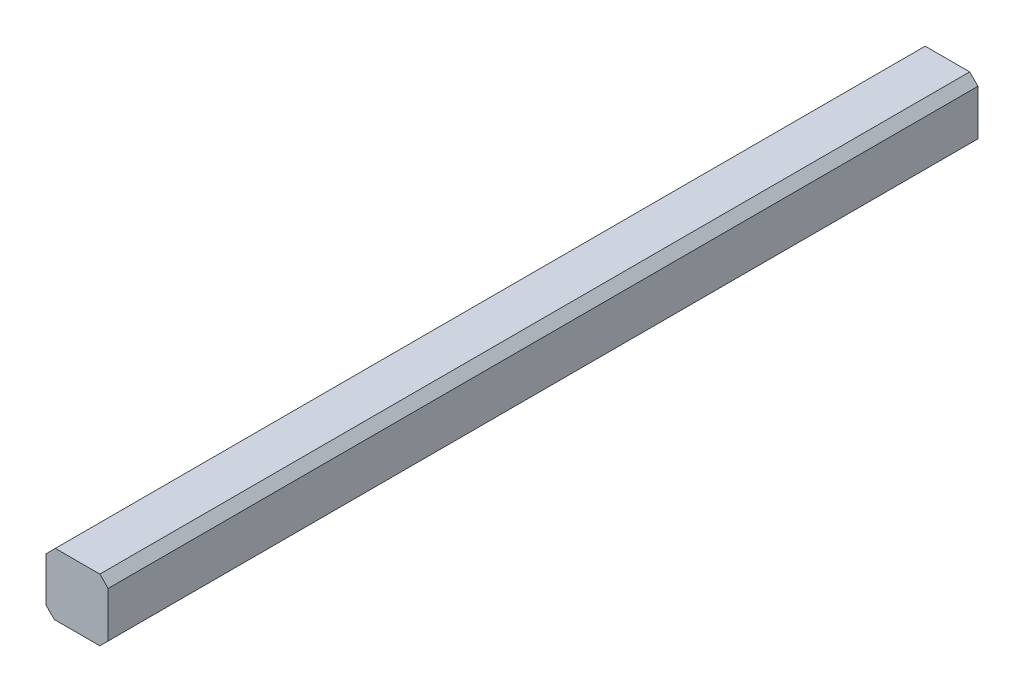
ISO-10303-21;
HEADER;
FILE_DESCRIPTION(('STEP AP214'),'2;1');
FILE_NAME('part.step','',(''),(''),'','','');
FILE_SCHEMA(('AUTOMOTIVE_DESIGN { 1 0 10303 214 1 1 1 1 }'));
ENDSEC;
DATA;
#1=APPLICATION_CONTEXT('core data for automotive mechanical design processes');
#2=APPLICATION_PROTOCOL_DEFINITION('international standard','automotive_design',2000,#1);
#3=PRODUCT_CONTEXT('',#1,'mechanical');
#4=PRODUCT('Part','Part','',(#3));
#5=PRODUCT_RELATED_PRODUCT_CATEGORY('part','',(#4));
#6=PRODUCT_DEFINITION_FORMATION('','',#4);
#7=PRODUCT_DEFINITION_CONTEXT('part definition',#1,'design');
#8=PRODUCT_DEFINITION('design','',#6,#7);
#9=PRODUCT_DEFINITION_SHAPE('','',#8);
#10=(LENGTH_UNIT() NAMED_UNIT(*) SI_UNIT(.MILLI.,.METRE.));
#11=(NAMED_UNIT(*) PLANE_ANGLE_UNIT() SI_UNIT($,.RADIAN.));
#12=(NAMED_UNIT(*) SI_UNIT($,.STERADIAN.) SOLID_ANGLE_UNIT());
#13=UNCERTAINTY_MEASURE_WITH_UNIT(LENGTH_MEASURE(1.E-05),#10,'distance_accuracy_value','');
#14=(GEOMETRIC_REPRESENTATION_CONTEXT(3) GLOBAL_UNCERTAINTY_ASSIGNED_CONTEXT((#13)) GLOBAL_UNIT_ASSIGNED_CONTEXT((#10,
#11,#12)) REPRESENTATION_CONTEXT('',''));
#15=CARTESIAN_POINT('',(0.,0.,0.));
#16=DIRECTION('',(0.,0.,1.));
#17=DIRECTION('',(1.,0.,0.));
#18=AXIS2_PLACEMENT_3D('',#15,#16,#17);
#19=CARTESIAN_POINT('',(-0.381,-0.2794,0.));
#20=DIRECTION('',(-1.,0.,0.));
#21=DIRECTION('',(0.,0.,1.));
#22=AXIS2_PLACEMENT_3D('',#19,#20,#21);
#23=PLANE('',#22);
#24=DIRECTION('',(0.,0.,1.));
#25=VECTOR('',#24,1.);
#26=CARTESIAN_POINT('',(-0.381,0.2667,0.));
#27=LINE('',#26,#25);
#28=CARTESIAN_POINT('',(-0.381,0.2667,0.));
#29=VERTEX_POINT('',#28);
#30=CARTESIAN_POINT('',(-0.381,0.2667,10.668));
#31=VERTEX_POINT('',#30);
#32=EDGE_CURVE('E86',#29,#31,#27,.T.);
#33=ORIENTED_EDGE('',*,*,#32,.F.);
#34=DIRECTION('',(0.,1.,0.));
#35=VECTOR('',#34,1.);
#36=CARTESIAN_POINT('',(-0.381,-0.2794,0.));
#37=LINE('',#36,#35);
#38=CARTESIAN_POINT('',(-0.381,-0.2794,0.));
#39=VERTEX_POINT('',#38);
#40=EDGE_CURVE('E79',#29,#39,#37,.F.);
#41=ORIENTED_EDGE('',*,*,#40,.T.);
#42=DIRECTION('',(0.,0.,1.));
#43=VECTOR('',#42,1.);
#44=CARTESIAN_POINT('',(-0.381,-0.2794,0.));
#45=LINE('',#44,#43);
#46=CARTESIAN_POINT('',(-0.381,-0.2794,10.668));
#47=VERTEX_POINT('',#46);
#48=EDGE_CURVE('E89',#47,#39,#45,.F.);
#49=ORIENTED_EDGE('',*,*,#48,.F.);
#50=DIRECTION('',(0.,1.,0.));
#51=VECTOR('',#50,1.);
#52=CARTESIAN_POINT('',(-0.381,-0.2794,10.668));
#53=LINE('',#52,#51);
#54=EDGE_CURVE('E20',#47,#31,#53,.T.);
#55=ORIENTED_EDGE('',*,*,#54,.T.);
#56=EDGE_LOOP('',(#33,#41,#49,#55));
#57=FACE_BOUND('',#56,.T.);
#58=ADVANCED_FACE('F17',(#57),#23,.T.);
#59=CARTESIAN_POINT('',(-0.381,0.2667,0.));
#60=DIRECTION('',(-0.707106781186548,0.707106781186548,0.));
#61=DIRECTION('',(-0.707106781186548,-0.707106781186548,0.));
#62=AXIS2_PLACEMENT_3D('',#59,#60,#61);
#63=PLANE('',#62);
#64=DIRECTION('',(0.,0.,1.));
#65=VECTOR('',#64,1.);
#66=CARTESIAN_POINT('',(-0.2667,0.381,0.));
#67=LINE('',#66,#65);
#68=CARTESIAN_POINT('',(-0.2667,0.381,0.));
#69=VERTEX_POINT('',#68);
#70=CARTESIAN_POINT('',(-0.2667,0.381,10.668));
#71=VERTEX_POINT('',#70);
#72=EDGE_CURVE('E111',#69,#71,#67,.T.);
#73=ORIENTED_EDGE('',*,*,#72,.F.);
#74=DIRECTION('',(-0.707106781186548,-0.707106781186548,0.));
#75=VECTOR('',#74,1.);
#76=CARTESIAN_POINT('',(-0.381,0.2667,0.));
#77=LINE('',#76,#75);
#78=EDGE_CURVE('E100',#69,#29,#77,.T.);
#79=ORIENTED_EDGE('',*,*,#78,.T.);
#80=ORIENTED_EDGE('',*,*,#32,.T.);
#81=DIRECTION('',(-0.707106781186548,-0.707106781186548,0.));
#82=VECTOR('',#81,1.);
#83=CARTESIAN_POINT('',(-0.381,0.2667,10.668));
#84=LINE('',#83,#82);
#85=EDGE_CURVE('E93',#31,#71,#84,.F.);
#86=ORIENTED_EDGE('',*,*,#85,.T.);
#87=EDGE_LOOP('',(#73,#79,#80,#86));
#88=FACE_BOUND('',#87,.T.);
#89=ADVANCED_FACE('F102',(#88),#63,.T.);
#90=CARTESIAN_POINT('',(-0.2794,-0.381,0.));
#91=DIRECTION('',(-0.707106781186548,-0.707106781186548,0.));
#92=DIRECTION('',(0.707106781186548,-0.707106781186548,0.));
#93=AXIS2_PLACEMENT_3D('',#90,#91,#92);
#94=PLANE('',#93);
#95=ORIENTED_EDGE('',*,*,#48,.T.);
#96=DIRECTION('',(0.707106781186548,-0.707106781186548,0.));
#97=VECTOR('',#96,1.);
#98=CARTESIAN_POINT('',(-0.2794,-0.381,0.));
#99=LINE('',#98,#97);
#100=CARTESIAN_POINT('',(-0.2794,-0.381,0.));
#101=VERTEX_POINT('',#100);
#102=EDGE_CURVE('E109',#39,#101,#99,.T.);
#103=ORIENTED_EDGE('',*,*,#102,.T.);
#104=DIRECTION('',(0.,0.,-1.));
#105=VECTOR('',#104,1.);
#106=CARTESIAN_POINT('',(-0.2794,-0.381,0.));
#107=LINE('',#106,#105);
#108=CARTESIAN_POINT('',(-0.2794,-0.381,10.668));
#109=VERTEX_POINT('',#108);
#110=EDGE_CURVE('E117',#109,#101,#107,.T.);
#111=ORIENTED_EDGE('',*,*,#110,.F.);
#112=DIRECTION('',(0.707106781186548,-0.707106781186548,0.));
#113=VECTOR('',#112,1.);
#114=CARTESIAN_POINT('',(-0.2794,-0.381,10.668));
#115=LINE('',#114,#113);
#116=EDGE_CURVE('E106',#109,#47,#115,.F.);
#117=ORIENTED_EDGE('',*,*,#116,.T.);
#118=EDGE_LOOP('',(#95,#103,#111,#117));
#119=FACE_BOUND('',#118,.T.);
#120=ADVANCED_FACE('F163',(#119),#94,.T.);
#121=CARTESIAN_POINT('',(-0.2667,0.381,0.));
#122=DIRECTION('',(0.,1.,0.));
#123=DIRECTION('',(0.,0.,1.));
#124=AXIS2_PLACEMENT_3D('',#121,#122,#123);
#125=PLANE('',#124);
#126=DIRECTION('',(0.,0.,1.));
#127=VECTOR('',#126,1.);
#128=CARTESIAN_POINT('',(0.2794,0.381,0.));
#129=LINE('',#128,#127);
#130=CARTESIAN_POINT('',(0.2794,0.381,0.));
#131=VERTEX_POINT('',#130);
#132=CARTESIAN_POINT('',(0.2794,0.381,10.668));
#133=VERTEX_POINT('',#132);
#134=EDGE_CURVE('E122',#131,#133,#129,.T.);
#135=ORIENTED_EDGE('',*,*,#134,.F.);
#136=DIRECTION('',(1.,0.,0.));
#137=VECTOR('',#136,1.);
#138=CARTESIAN_POINT('',(-0.2667,0.381,0.));
#139=LINE('',#138,#137);
#140=EDGE_CURVE('E114',#131,#69,#139,.F.);
#141=ORIENTED_EDGE('',*,*,#140,.T.);
#142=ORIENTED_EDGE('',*,*,#72,.T.);
#143=DIRECTION('',(1.,0.,0.));
#144=VECTOR('',#143,1.);
#145=CARTESIAN_POINT('',(-0.2667,0.381,10.668));
#146=LINE('',#145,#144);
#147=EDGE_CURVE('E96',#71,#133,#146,.T.);
#148=ORIENTED_EDGE('',*,*,#147,.T.);
#149=EDGE_LOOP('',(#135,#141,#142,#148));
#150=FACE_BOUND('',#149,.T.);
#151=ADVANCED_FACE('F161',(#150),#125,.T.);
#152=CARTESIAN_POINT('',(0.2794,-0.381,0.));
#153=DIRECTION('',(0.,-1.,0.));
#154=DIRECTION('',(0.,0.,-1.));
#155=AXIS2_PLACEMENT_3D('',#152,#153,#154);
#156=PLANE('',#155);
#157=ORIENTED_EDGE('',*,*,#110,.T.);
#158=DIRECTION('',(1.,0.,0.));
#159=VECTOR('',#158,1.);
#160=CARTESIAN_POINT('',(0.2794,-0.381,0.));
#161=LINE('',#160,#159);
#162=CARTESIAN_POINT('',(0.279400000000018,-0.381000000000018,0.));
#163=VERTEX_POINT('',#162);
#164=EDGE_CURVE('E120',#101,#163,#161,.T.);
#165=ORIENTED_EDGE('',*,*,#164,.T.);
#166=DIRECTION('',(0.,0.,1.));
#167=VECTOR('',#166,1.);
#168=CARTESIAN_POINT('',(0.279400000000072,-0.381000000000072,0.));
#169=LINE('',#168,#167);
#170=CARTESIAN_POINT('',(0.279400000000018,-0.381000000000018,10.668));
#171=VERTEX_POINT('',#170);
#172=EDGE_CURVE('E132',#171,#163,#169,.F.);
#173=ORIENTED_EDGE('',*,*,#172,.F.);
#174=DIRECTION('',(1.,0.,0.));
#175=VECTOR('',#174,1.);
#176=CARTESIAN_POINT('',(-0.381,-0.381,10.668));
#177=LINE('',#176,#175);
#178=EDGE_CURVE('E125',#109,#171,#177,.T.);
#179=ORIENTED_EDGE('',*,*,#178,.F.);
#180=EDGE_LOOP('',(#157,#165,#173,#179));
#181=FACE_BOUND('',#180,.T.);
#182=ADVANCED_FACE('F153',(#181),#156,.T.);
#183=CARTESIAN_POINT('',(0.2794,0.381,0.));
#184=DIRECTION('',(0.707106781187048,0.707106781186048,0.));
#185=DIRECTION('',(-0.707106781186048,0.707106781187048,0.));
#186=AXIS2_PLACEMENT_3D('',#183,#184,#185);
#187=PLANE('',#186);
#188=DIRECTION('',(0.,0.,-1.));
#189=VECTOR('',#188,1.);
#190=CARTESIAN_POINT('',(0.381,0.2794,0.));
#191=LINE('',#190,#189);
#192=CARTESIAN_POINT('',(0.380999999999964,0.279399999999964,0.));
#193=VERTEX_POINT('',#192);
#194=CARTESIAN_POINT('',(0.380999999999964,0.279399999999964,10.668));
#195=VERTEX_POINT('',#194);
#196=EDGE_CURVE('E138',#193,#195,#191,.F.);
#197=ORIENTED_EDGE('',*,*,#196,.F.);
#198=DIRECTION('',(-0.707106781186547,0.707106781186548,0.));
#199=VECTOR('',#198,1.);
#200=CARTESIAN_POINT('',(0.381,0.2794,0.));
#201=LINE('',#200,#199);
#202=EDGE_CURVE('E135',#193,#131,#201,.T.);
#203=ORIENTED_EDGE('',*,*,#202,.T.);
#204=ORIENTED_EDGE('',*,*,#134,.T.);
#205=DIRECTION('',(-0.707106781186547,0.707106781186548,0.));
#206=VECTOR('',#205,1.);
#207=CARTESIAN_POINT('',(0.381,0.2794,10.668));
#208=LINE('',#207,#206);
#209=EDGE_CURVE('E127',#195,#133,#208,.T.);
#210=ORIENTED_EDGE('',*,*,#209,.F.);
#211=EDGE_LOOP('',(#197,#203,#204,#210));
#212=FACE_BOUND('',#211,.T.);
#213=ADVANCED_FACE('F159',(#212),#187,.T.);
#214=CARTESIAN_POINT('',(-0.381,-0.2794,10.668));
#215=DIRECTION('',(0.,0.,1.));
#216=DIRECTION('',(1.,0.,0.));
#217=AXIS2_PLACEMENT_3D('',#214,#215,#216);
#218=PLANE('',#217);
#219=ORIENTED_EDGE('',*,*,#85,.F.);
#220=ORIENTED_EDGE('',*,*,#54,.F.);
#221=ORIENTED_EDGE('',*,*,#116,.F.);
#222=ORIENTED_EDGE('',*,*,#178,.T.);
#223=DIRECTION('',(0.707106781186048,0.707106781187048,0.));
#224=VECTOR('',#223,1.);
#225=CARTESIAN_POINT('',(0.381,-0.2794,10.668));
#226=LINE('',#225,#224);
#227=CARTESIAN_POINT('',(0.381,-0.2794,10.668));
#228=VERTEX_POINT('',#227);
#229=EDGE_CURVE('E129',#228,#171,#226,.F.);
#230=ORIENTED_EDGE('',*,*,#229,.F.);
#231=DIRECTION('',(0.,1.,0.));
#232=VECTOR('',#231,1.);
#233=CARTESIAN_POINT('',(0.381,0.2794,10.668));
#234=LINE('',#233,#232);
#235=EDGE_CURVE('E141',#195,#228,#234,.F.);
#236=ORIENTED_EDGE('',*,*,#235,.F.);
#237=ORIENTED_EDGE('',*,*,#209,.T.);
#238=ORIENTED_EDGE('',*,*,#147,.F.);
#239=EDGE_LOOP('',(#219,#220,#221,#222,#230,#236,#237,#238));
#240=FACE_BOUND('',#239,.T.);
#241=ADVANCED_FACE('F94',(#240),#218,.T.);
#242=CARTESIAN_POINT('',(0.381,-0.2794,0.));
#243=DIRECTION('',(0.707106781187048,-0.707106781186048,0.));
#244=DIRECTION('',(0.707106781186048,0.707106781187048,0.));
#245=AXIS2_PLACEMENT_3D('',#242,#243,#244);
#246=PLANE('',#245);
#247=ORIENTED_EDGE('',*,*,#172,.T.);
#248=DIRECTION('',(0.707106781186547,0.707106781186548,0.));
#249=VECTOR('',#248,1.);
#250=CARTESIAN_POINT('',(0.2794,-0.381,0.));
#251=LINE('',#250,#249);
#252=CARTESIAN_POINT('',(0.381,-0.2794,0.));
#253=VERTEX_POINT('',#252);
#254=EDGE_CURVE('E35',#163,#253,#251,.T.);
#255=ORIENTED_EDGE('',*,*,#254,.T.);
#256=DIRECTION('',(0.,0.,-1.));
#257=VECTOR('',#256,1.);
#258=CARTESIAN_POINT('',(0.381,-0.2794,0.));
#259=LINE('',#258,#257);
#260=EDGE_CURVE('E26',#228,#253,#259,.T.);
#261=ORIENTED_EDGE('',*,*,#260,.F.);
#262=ORIENTED_EDGE('',*,*,#229,.T.);
#263=EDGE_LOOP('',(#247,#255,#261,#262));
#264=FACE_BOUND('',#263,.T.);
#265=ADVANCED_FACE('F148',(#264),#246,.T.);
#266=CARTESIAN_POINT('',(-0.381,-0.2794,0.));
#267=DIRECTION('',(0.,0.,1.));
#268=DIRECTION('',(1.,0.,0.));
#269=AXIS2_PLACEMENT_3D('',#266,#267,#268);
#270=PLANE('',#269);
#271=ORIENTED_EDGE('',*,*,#78,.F.);
#272=ORIENTED_EDGE('',*,*,#140,.F.);
#273=ORIENTED_EDGE('',*,*,#202,.F.);
#274=DIRECTION('',(0.,1.,0.));
#275=VECTOR('',#274,1.);
#276=CARTESIAN_POINT('',(0.381,0.2794,0.));
#277=LINE('',#276,#275);
#278=EDGE_CURVE('E11',#253,#193,#277,.T.);
#279=ORIENTED_EDGE('',*,*,#278,.F.);
#280=ORIENTED_EDGE('',*,*,#254,.F.);
#281=ORIENTED_EDGE('',*,*,#164,.F.);
#282=ORIENTED_EDGE('',*,*,#102,.F.);
#283=ORIENTED_EDGE('',*,*,#40,.F.);
#284=EDGE_LOOP('',(#271,#272,#273,#279,#280,#281,#282,#283));
#285=FACE_BOUND('',#284,.T.);
#286=ADVANCED_FACE('F155',(#285),#270,.F.);
#287=CARTESIAN_POINT('',(0.381,0.2794,0.));
#288=DIRECTION('',(1.,0.,0.));
#289=DIRECTION('',(0.,0.,-1.));
#290=AXIS2_PLACEMENT_3D('',#287,#288,#289);
#291=PLANE('',#290);
#292=ORIENTED_EDGE('',*,*,#260,.T.);
#293=ORIENTED_EDGE('',*,*,#278,.T.);
#294=ORIENTED_EDGE('',*,*,#196,.T.);
#295=ORIENTED_EDGE('',*,*,#235,.T.);
#296=EDGE_LOOP('',(#292,#293,#294,#295));
#297=FACE_BOUND('',#296,.T.);
#298=ADVANCED_FACE('F146',(#297),#291,.T.);
#299=CLOSED_SHELL('',(#58,#89,#120,#151,#182,#213,#241,#265,#286,#298));
#300=MANIFOLD_SOLID_BREP('B1',#299);
#301=ADVANCED_BREP_SHAPE_REPRESENTATION('',(#18,#300),#14);
#302=SHAPE_DEFINITION_REPRESENTATION(#9,#301);
ENDSEC;
END-ISO-10303-21;
